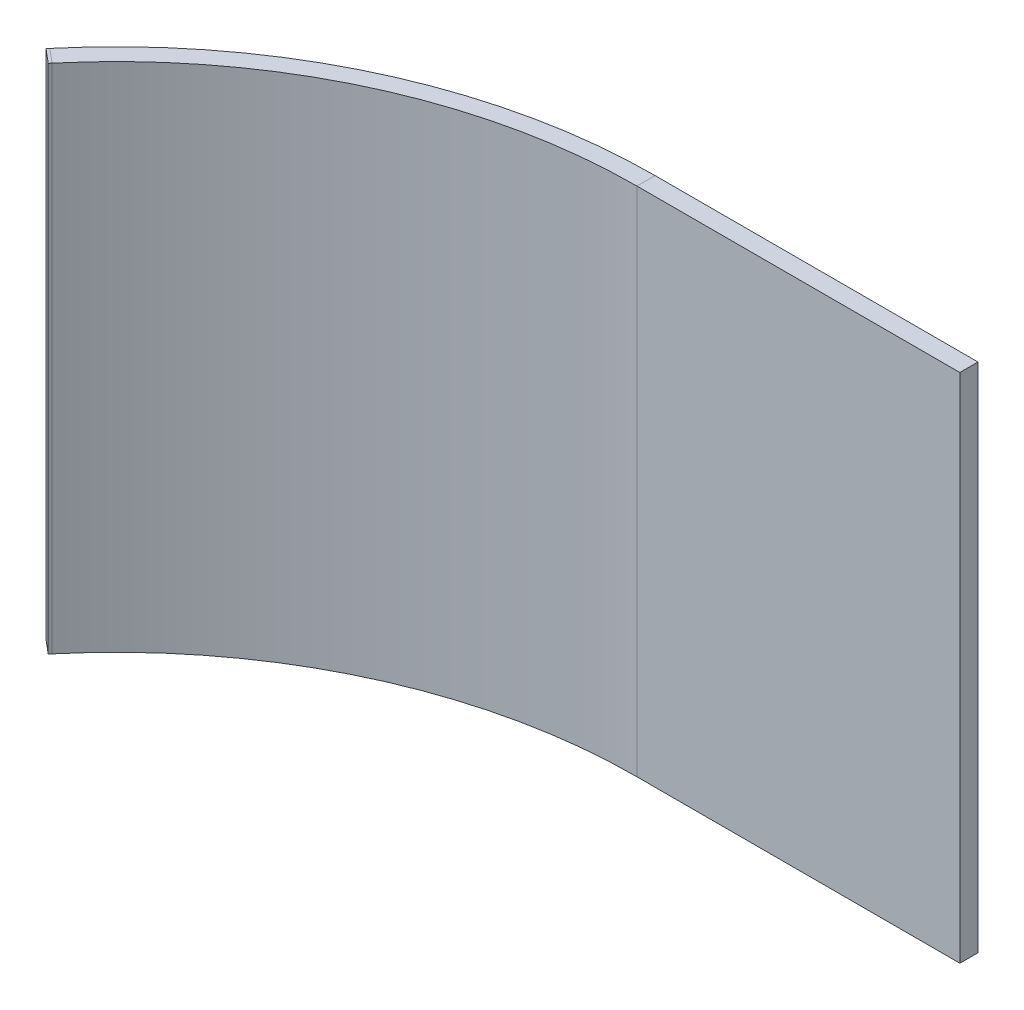
ISO-10303-21;
HEADER;
FILE_DESCRIPTION(('STEP AP214'),'2;1');
FILE_NAME('part.step','',(''),(''),'','','');
FILE_SCHEMA(('AUTOMOTIVE_DESIGN { 1 0 10303 214 1 1 1 1 }'));
ENDSEC;
DATA;
#1=APPLICATION_CONTEXT('core data for automotive mechanical design processes');
#2=APPLICATION_PROTOCOL_DEFINITION('international standard','automotive_design',2000,#1);
#3=PRODUCT_CONTEXT('',#1,'mechanical');
#4=PRODUCT('Part','Part','',(#3));
#5=PRODUCT_RELATED_PRODUCT_CATEGORY('part','',(#4));
#6=PRODUCT_DEFINITION_FORMATION('','',#4);
#7=PRODUCT_DEFINITION_CONTEXT('part definition',#1,'design');
#8=PRODUCT_DEFINITION('design','',#6,#7);
#9=PRODUCT_DEFINITION_SHAPE('','',#8);
#10=(LENGTH_UNIT() NAMED_UNIT(*) SI_UNIT(.MILLI.,.METRE.));
#11=(NAMED_UNIT(*) PLANE_ANGLE_UNIT() SI_UNIT($,.RADIAN.));
#12=(NAMED_UNIT(*) SI_UNIT($,.STERADIAN.) SOLID_ANGLE_UNIT());
#13=UNCERTAINTY_MEASURE_WITH_UNIT(LENGTH_MEASURE(1.E-05),#10,'distance_accuracy_value','');
#14=(GEOMETRIC_REPRESENTATION_CONTEXT(3) GLOBAL_UNCERTAINTY_ASSIGNED_CONTEXT((#13)) GLOBAL_UNIT_ASSIGNED_CONTEXT((#10,
#11,#12)) REPRESENTATION_CONTEXT('',''));
#15=CARTESIAN_POINT('',(0.,0.,0.));
#16=DIRECTION('',(0.,0.,1.));
#17=DIRECTION('',(1.,0.,0.));
#18=AXIS2_PLACEMENT_3D('',#15,#16,#17);
#19=CARTESIAN_POINT('',(89.,141.,10.));
#20=DIRECTION('',(-1.,0.,0.));
#21=DIRECTION('',(0.,-1.,0.));
#22=AXIS2_PLACEMENT_3D('',#19,#20,#21);
#23=PLANE('',#22);
#24=DIRECTION('',(0.,1.,0.));
#25=VECTOR('',#24,1.);
#26=CARTESIAN_POINT('',(89.,141.,0.));
#27=LINE('',#26,#25);
#28=CARTESIAN_POINT('',(89.,-141.,0.));
#29=VERTEX_POINT('',#28);
#30=CARTESIAN_POINT('',(89.,141.,0.));
#31=VERTEX_POINT('',#30);
#32=EDGE_CURVE('E194',#29,#31,#27,.T.);
#33=ORIENTED_EDGE('',*,*,#32,.T.);
#34=DIRECTION('',(0.,0.,-1.));
#35=VECTOR('',#34,1.);
#36=CARTESIAN_POINT('',(89.,141.,10.));
#37=LINE('',#36,#35);
#38=CARTESIAN_POINT('',(89.,141.,10.));
#39=VERTEX_POINT('',#38);
#40=EDGE_CURVE('E14',#39,#31,#37,.T.);
#41=ORIENTED_EDGE('',*,*,#40,.F.);
#42=DIRECTION('',(0.,1.,0.));
#43=VECTOR('',#42,1.);
#44=CARTESIAN_POINT('',(89.,141.,10.));
#45=LINE('',#44,#43);
#46=CARTESIAN_POINT('',(89.,-141.,10.));
#47=VERTEX_POINT('',#46);
#48=EDGE_CURVE('E199',#47,#39,#45,.T.);
#49=ORIENTED_EDGE('',*,*,#48,.F.);
#50=DIRECTION('',(0.,0.,-1.));
#51=VECTOR('',#50,1.);
#52=CARTESIAN_POINT('',(89.,-141.,10.));
#53=LINE('',#52,#51);
#54=EDGE_CURVE('E205',#47,#29,#53,.T.);
#55=ORIENTED_EDGE('',*,*,#54,.T.);
#56=EDGE_LOOP('',(#33,#41,#49,#55));
#57=FACE_BOUND('',#56,.T.);
#58=ADVANCED_FACE('F68',(#57),#23,.F.);
#59=CARTESIAN_POINT('',(-89.,141.,10.));
#60=DIRECTION('',(0.,-1.,0.));
#61=DIRECTION('',(0.,0.,-1.));
#62=AXIS2_PLACEMENT_3D('',#59,#60,#61);
#63=PLANE('',#62);
#64=DIRECTION('',(-1.,0.,0.));
#65=VECTOR('',#64,1.);
#66=CARTESIAN_POINT('',(-89.,141.,0.));
#67=LINE('',#66,#65);
#68=CARTESIAN_POINT('',(-89.,141.,0.));
#69=VERTEX_POINT('',#68);
#70=EDGE_CURVE('E97',#31,#69,#67,.T.);
#71=ORIENTED_EDGE('',*,*,#70,.T.);
#72=DIRECTION('',(0.,0.,-1.));
#73=VECTOR('',#72,1.);
#74=CARTESIAN_POINT('',(-89.,141.,10.));
#75=LINE('',#74,#73);
#76=CARTESIAN_POINT('',(-89.,141.,10.));
#77=VERTEX_POINT('',#76);
#78=EDGE_CURVE('E76',#77,#69,#75,.T.);
#79=ORIENTED_EDGE('',*,*,#78,.F.);
#80=DIRECTION('',(-1.,0.,0.));
#81=VECTOR('',#80,1.);
#82=CARTESIAN_POINT('',(-89.,141.,10.));
#83=LINE('',#82,#81);
#84=EDGE_CURVE('E109',#39,#77,#83,.T.);
#85=ORIENTED_EDGE('',*,*,#84,.F.);
#86=ORIENTED_EDGE('',*,*,#40,.T.);
#87=EDGE_LOOP('',(#71,#79,#85,#86));
#88=FACE_BOUND('',#87,.T.);
#89=ADVANCED_FACE('F218',(#88),#63,.F.);
#90=CARTESIAN_POINT('',(-88.9999999999999,-141.,10.));
#91=DIRECTION('',(0.,1.,0.));
#92=DIRECTION('',(0.,0.,1.));
#93=AXIS2_PLACEMENT_3D('',#90,#91,#92);
#94=PLANE('',#93);
#95=DIRECTION('',(1.,0.,0.));
#96=VECTOR('',#95,1.);
#97=CARTESIAN_POINT('',(-88.9999999999999,-141.,0.));
#98=LINE('',#97,#96);
#99=CARTESIAN_POINT('',(-88.9999999999999,-141.,0.));
#100=VERTEX_POINT('',#99);
#101=EDGE_CURVE('E104',#100,#29,#98,.T.);
#102=ORIENTED_EDGE('',*,*,#101,.T.);
#103=ORIENTED_EDGE('',*,*,#54,.F.);
#104=DIRECTION('',(1.,0.,0.));
#105=VECTOR('',#104,1.);
#106=CARTESIAN_POINT('',(-88.9999999999999,-141.,10.));
#107=LINE('',#106,#105);
#108=CARTESIAN_POINT('',(-88.9999999999999,-141.,10.));
#109=VERTEX_POINT('',#108);
#110=EDGE_CURVE('E84',#109,#47,#107,.T.);
#111=ORIENTED_EDGE('',*,*,#110,.F.);
#112=DIRECTION('',(0.,0.,-1.));
#113=VECTOR('',#112,1.);
#114=CARTESIAN_POINT('',(-88.9999999999999,-141.,10.));
#115=LINE('',#114,#113);
#116=EDGE_CURVE('E212',#109,#100,#115,.T.);
#117=ORIENTED_EDGE('',*,*,#116,.T.);
#118=EDGE_LOOP('',(#102,#103,#111,#117));
#119=FACE_BOUND('',#118,.T.);
#120=ADVANCED_FACE('F223',(#119),#94,.F.);
#121=CARTESIAN_POINT('',(0.,0.,10.));
#122=DIRECTION('',(0.,0.,1.));
#123=DIRECTION('',(1.,0.,0.));
#124=AXIS2_PLACEMENT_3D('',#121,#122,#123);
#125=PLANE('',#124);
#126=ORIENTED_EDGE('',*,*,#48,.T.);
#127=ORIENTED_EDGE('',*,*,#84,.T.);
#128=DIRECTION('',(0.,-1.,0.));
#129=VECTOR('',#128,1.);
#130=CARTESIAN_POINT('',(-89.,141.,10.));
#131=LINE('',#130,#129);
#132=EDGE_CURVE('E202',#77,#109,#131,.T.);
#133=ORIENTED_EDGE('',*,*,#132,.T.);
#134=ORIENTED_EDGE('',*,*,#110,.T.);
#135=EDGE_LOOP('',(#126,#127,#133,#134));
#136=FACE_BOUND('',#135,.T.);
#137=ADVANCED_FACE('F222',(#136),#125,.T.);
#138=CARTESIAN_POINT('',(0.,0.,0.));
#139=DIRECTION('',(0.,0.,1.));
#140=DIRECTION('',(1.,0.,0.));
#141=AXIS2_PLACEMENT_3D('',#138,#139,#140);
#142=PLANE('',#141);
#143=ORIENTED_EDGE('',*,*,#32,.F.);
#144=ORIENTED_EDGE('',*,*,#101,.F.);
#145=DIRECTION('',(0.,-1.,0.));
#146=VECTOR('',#145,1.);
#147=CARTESIAN_POINT('',(-89.,141.,0.));
#148=LINE('',#147,#146);
#149=EDGE_CURVE('E145',#69,#100,#148,.T.);
#150=ORIENTED_EDGE('',*,*,#149,.F.);
#151=ORIENTED_EDGE('',*,*,#70,.F.);
#152=EDGE_LOOP('',(#143,#144,#150,#151));
#153=FACE_BOUND('',#152,.T.);
#154=ADVANCED_FACE('F229',(#153),#142,.F.);
#155=CARTESIAN_POINT('',(-89.,141.,297.));
#156=DIRECTION('',(0.,1.,0.));
#157=DIRECTION('',(-1.,0.,0.));
#158=AXIS2_PLACEMENT_3D('',#155,#156,#157);
#159=PLANE('',#158);
#160=DIRECTION('',(-0.766044443118975,0.,-0.642787609686543));
#161=VECTOR('',#160,1.);
#162=CARTESIAN_POINT('',(-316.515199606335,141.,106.092079923097));
#163=LINE('',#162,#161);
#164=CARTESIAN_POINT('',(-308.854755175146,141.,112.519956019962));
#165=VERTEX_POINT('',#164);
#166=CARTESIAN_POINT('',(-316.515199606335,141.,106.092079923097));
#167=VERTEX_POINT('',#166);
#168=EDGE_CURVE('E191',#165,#167,#163,.T.);
#169=ORIENTED_EDGE('',*,*,#168,.F.);
#170=CARTESIAN_POINT('',(-89.,141.,297.));
#171=DIRECTION('',(0.,-1.,0.));
#172=DIRECTION('',(1.,0.,0.));
#173=AXIS2_PLACEMENT_3D('',#170,#171,#172);
#174=CIRCLE('',#173,287.);
#175=EDGE_CURVE('E149',#77,#165,#174,.F.);
#176=ORIENTED_EDGE('',*,*,#175,.F.);
#177=ORIENTED_EDGE('',*,*,#78,.T.);
#178=CARTESIAN_POINT('',(-89.,141.,297.));
#179=DIRECTION('',(0.,-1.,0.));
#180=DIRECTION('',(1.,0.,0.));
#181=AXIS2_PLACEMENT_3D('',#178,#179,#180);
#182=CIRCLE('',#181,297.);
#183=EDGE_CURVE('E148',#69,#167,#182,.F.);
#184=ORIENTED_EDGE('',*,*,#183,.T.);
#185=EDGE_LOOP('',(#169,#176,#177,#184));
#186=FACE_BOUND('',#185,.T.);
#187=ADVANCED_FACE('F216',(#186),#159,.T.);
#188=CARTESIAN_POINT('',(-88.9999999999999,-141.,297.));
#189=DIRECTION('',(0.,1.,0.));
#190=DIRECTION('',(-1.,0.,0.));
#191=AXIS2_PLACEMENT_3D('',#188,#189,#190);
#192=PLANE('',#191);
#193=CARTESIAN_POINT('',(-88.9999999999999,-141.,297.));
#194=DIRECTION('',(0.,-1.,0.));
#195=DIRECTION('',(1.,0.,0.));
#196=AXIS2_PLACEMENT_3D('',#193,#194,#195);
#197=CIRCLE('',#196,287.);
#198=CARTESIAN_POINT('',(-308.854755175146,-141.,112.519956019962));
#199=VERTEX_POINT('',#198);
#200=EDGE_CURVE('E156',#199,#109,#197,.T.);
#201=ORIENTED_EDGE('',*,*,#200,.F.);
#202=DIRECTION('',(-0.766044443118975,0.,-0.642787609686543));
#203=VECTOR('',#202,1.);
#204=CARTESIAN_POINT('',(-308.854755175146,-141.,112.519956019962));
#205=LINE('',#204,#203);
#206=CARTESIAN_POINT('',(-316.515199606335,-141.,106.092079923097));
#207=VERTEX_POINT('',#206);
#208=EDGE_CURVE('E153',#199,#207,#205,.T.);
#209=ORIENTED_EDGE('',*,*,#208,.T.);
#210=CARTESIAN_POINT('',(-88.9999999999999,-141.,297.));
#211=DIRECTION('',(0.,-1.,0.));
#212=DIRECTION('',(1.,0.,0.));
#213=AXIS2_PLACEMENT_3D('',#210,#211,#212);
#214=CIRCLE('',#213,297.);
#215=EDGE_CURVE('E138',#207,#100,#214,.T.);
#216=ORIENTED_EDGE('',*,*,#215,.T.);
#217=ORIENTED_EDGE('',*,*,#116,.F.);
#218=EDGE_LOOP('',(#201,#209,#216,#217));
#219=FACE_BOUND('',#218,.T.);
#220=ADVANCED_FACE('F154',(#219),#192,.F.);
#221=CARTESIAN_POINT('',(-88.9999999999999,-141.,297.));
#222=DIRECTION('',(0.,-1.,0.));
#223=DIRECTION('',(-0.766044443118975,0.,-0.642787609686543));
#224=AXIS2_PLACEMENT_3D('',#221,#222,#223);
#225=CYLINDRICAL_SURFACE('',#224,297.);
#226=ORIENTED_EDGE('',*,*,#149,.T.);
#227=ORIENTED_EDGE('',*,*,#215,.F.);
#228=DIRECTION('',(0.,-1.,0.));
#229=VECTOR('',#228,1.);
#230=CARTESIAN_POINT('',(-316.515199606335,0.,106.092079923097));
#231=LINE('',#230,#229);
#232=EDGE_CURVE('E143',#167,#207,#231,.T.);
#233=ORIENTED_EDGE('',*,*,#232,.F.);
#234=ORIENTED_EDGE('',*,*,#183,.F.);
#235=EDGE_LOOP('',(#226,#227,#233,#234));
#236=FACE_BOUND('',#235,.T.);
#237=ADVANCED_FACE('F140',(#236),#225,.T.);
#238=CARTESIAN_POINT('',(-88.9999999999999,-141.,297.));
#239=DIRECTION('',(0.,-1.,0.));
#240=DIRECTION('',(-0.766044443118975,0.,-0.642787609686543));
#241=AXIS2_PLACEMENT_3D('',#238,#239,#240);
#242=CYLINDRICAL_SURFACE('',#241,287.);
#243=ORIENTED_EDGE('',*,*,#132,.F.);
#244=ORIENTED_EDGE('',*,*,#175,.T.);
#245=DIRECTION('',(0.,1.,0.));
#246=VECTOR('',#245,1.);
#247=CARTESIAN_POINT('',(-308.854755175146,141.,112.519956019962));
#248=LINE('',#247,#246);
#249=EDGE_CURVE('E161',#165,#199,#248,.F.);
#250=ORIENTED_EDGE('',*,*,#249,.T.);
#251=ORIENTED_EDGE('',*,*,#200,.T.);
#252=EDGE_LOOP('',(#243,#244,#250,#251));
#253=FACE_BOUND('',#252,.T.);
#254=ADVANCED_FACE('F220',(#253),#242,.F.);
#255=CARTESIAN_POINT('',(-230.490742321673,-141.,3.57212390313456));
#256=DIRECTION('',(0.,-1.,0.));
#257=DIRECTION('',(0.,0.,-1.));
#258=AXIS2_PLACEMENT_3D('',#255,#256,#257);
#259=PLANE('',#258);
#260=DIRECTION('',(0.642787609686543,0.,-0.766044443118975));
#261=VECTOR('',#260,1.);
#262=CARTESIAN_POINT('',(-230.490742321673,-141.,3.57212390313456));
#263=LINE('',#262,#261);
#264=CARTESIAN_POINT('',(-317.48363982815,-141.,107.246222036656));
#265=VERTEX_POINT('',#264);
#266=EDGE_CURVE('E168',#265,#207,#263,.T.);
#267=ORIENTED_EDGE('',*,*,#266,.T.);
#268=ORIENTED_EDGE('',*,*,#208,.F.);
#269=DIRECTION('',(-0.642787609686543,0.,0.766044443118975));
#270=VECTOR('',#269,1.);
#271=CARTESIAN_POINT('',(-181.133603031601,-141.,-39.6921858973778));
#272=LINE('',#271,#270);
#273=CARTESIAN_POINT('',(-309.82319539696,-141.,113.674098133522));
#274=VERTEX_POINT('',#273);
#275=EDGE_CURVE('E184',#274,#199,#272,.F.);
#276=ORIENTED_EDGE('',*,*,#275,.F.);
#277=DIRECTION('',(0.766044443118975,0.,0.642787609686543));
#278=VECTOR('',#277,1.);
#279=CARTESIAN_POINT('',(-317.48363982815,-141.,107.246222036656));
#280=LINE('',#279,#278);
#281=EDGE_CURVE('E173',#265,#274,#280,.T.);
#282=ORIENTED_EDGE('',*,*,#281,.F.);
#283=EDGE_LOOP('',(#267,#268,#276,#282));
#284=FACE_BOUND('',#283,.T.);
#285=ADVANCED_FACE('F172',(#284),#259,.T.);
#286=CARTESIAN_POINT('',(-317.48363982815,141.,107.246222036656));
#287=DIRECTION('',(0.,1.,0.));
#288=DIRECTION('',(0.,0.,1.));
#289=AXIS2_PLACEMENT_3D('',#286,#287,#288);
#290=PLANE('',#289);
#291=DIRECTION('',(0.642787609686543,0.,-0.766044443118975));
#292=VECTOR('',#291,1.);
#293=CARTESIAN_POINT('',(-181.1336030316,141.,-39.6921858973781));
#294=LINE('',#293,#292);
#295=CARTESIAN_POINT('',(-309.82319539696,141.,113.674098133522));
#296=VERTEX_POINT('',#295);
#297=EDGE_CURVE('E170',#165,#296,#294,.F.);
#298=ORIENTED_EDGE('',*,*,#297,.F.);
#299=ORIENTED_EDGE('',*,*,#168,.T.);
#300=DIRECTION('',(-0.642787609686543,0.,0.766044443118975));
#301=VECTOR('',#300,1.);
#302=CARTESIAN_POINT('',(-317.48363982815,141.,107.246222036656));
#303=LINE('',#302,#301);
#304=CARTESIAN_POINT('',(-317.48363982815,141.,107.246222036656));
#305=VERTEX_POINT('',#304);
#306=EDGE_CURVE('E169',#167,#305,#303,.T.);
#307=ORIENTED_EDGE('',*,*,#306,.T.);
#308=DIRECTION('',(0.766044443118975,0.,0.642787609686543));
#309=VECTOR('',#308,1.);
#310=CARTESIAN_POINT('',(-317.48363982815,141.,107.246222036656));
#311=LINE('',#310,#309);
#312=EDGE_CURVE('E175',#305,#296,#311,.T.);
#313=ORIENTED_EDGE('',*,*,#312,.T.);
#314=EDGE_LOOP('',(#298,#299,#307,#313));
#315=FACE_BOUND('',#314,.T.);
#316=ADVANCED_FACE('F301',(#315),#290,.T.);
#317=CARTESIAN_POINT('',(-188.79404746279,0.,-46.1200619942434));
#318=DIRECTION('',(-0.766044443118975,0.,-0.642787609686543));
#319=DIRECTION('',(-0.642787609686543,0.,0.766044443118975));
#320=AXIS2_PLACEMENT_3D('',#317,#318,#319);
#321=PLANE('',#320);
#322=ORIENTED_EDGE('',*,*,#306,.F.);
#323=ORIENTED_EDGE('',*,*,#232,.T.);
#324=ORIENTED_EDGE('',*,*,#266,.F.);
#325=DIRECTION('',(0.,-1.,0.));
#326=VECTOR('',#325,1.);
#327=CARTESIAN_POINT('',(-317.48363982815,-141.,107.246222036656));
#328=LINE('',#327,#326);
#329=EDGE_CURVE('E176',#305,#265,#328,.T.);
#330=ORIENTED_EDGE('',*,*,#329,.F.);
#331=EDGE_LOOP('',(#322,#323,#324,#330));
#332=FACE_BOUND('',#331,.T.);
#333=ADVANCED_FACE('F166',(#332),#321,.T.);
#334=CARTESIAN_POINT('',(-181.133603031601,0.,-39.6921858973779));
#335=DIRECTION('',(-0.766044443118975,0.,-0.642787609686543));
#336=DIRECTION('',(-0.642787609686543,0.,0.766044443118975));
#337=AXIS2_PLACEMENT_3D('',#334,#335,#336);
#338=PLANE('',#337);
#339=ORIENTED_EDGE('',*,*,#249,.F.);
#340=ORIENTED_EDGE('',*,*,#297,.T.);
#341=DIRECTION('',(0.,1.,0.));
#342=VECTOR('',#341,1.);
#343=CARTESIAN_POINT('',(-309.82319539696,0.,113.674098133522));
#344=LINE('',#343,#342);
#345=EDGE_CURVE('E186',#296,#274,#344,.F.);
#346=ORIENTED_EDGE('',*,*,#345,.T.);
#347=ORIENTED_EDGE('',*,*,#275,.T.);
#348=EDGE_LOOP('',(#339,#340,#346,#347));
#349=FACE_BOUND('',#348,.T.);
#350=ADVANCED_FACE('F321',(#349),#338,.F.);
#351=CARTESIAN_POINT('',(-317.48363982815,-141.,107.246222036656));
#352=DIRECTION('',(-0.642787609686543,0.,0.766044443118975));
#353=DIRECTION('',(0.766044443118975,0.,0.642787609686543));
#354=AXIS2_PLACEMENT_3D('',#351,#352,#353);
#355=PLANE('',#354);
#356=ORIENTED_EDGE('',*,*,#345,.F.);
#357=ORIENTED_EDGE('',*,*,#312,.F.);
#358=ORIENTED_EDGE('',*,*,#329,.T.);
#359=ORIENTED_EDGE('',*,*,#281,.T.);
#360=EDGE_LOOP('',(#356,#357,#358,#359));
#361=FACE_BOUND('',#360,.T.);
#362=ADVANCED_FACE('F331',(#361),#355,.T.);
#363=CLOSED_SHELL('',(#58,#89,#120,#137,#154,#187,#220,#237,#254,#285,#316,#333,#350,#362));
#364=MANIFOLD_SOLID_BREP('B2',#363);
#365=ADVANCED_BREP_SHAPE_REPRESENTATION('',(#18,#364),#14);
#366=SHAPE_DEFINITION_REPRESENTATION(#9,#365);
ENDSEC;
END-ISO-10303-21;
